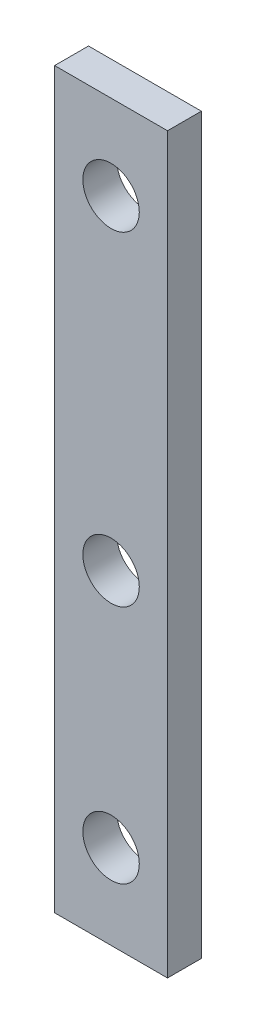
ISO-10303-21;
HEADER;
FILE_DESCRIPTION(('STEP AP214'),'2;1');
FILE_NAME('part.step','',(''),(''),'','','');
FILE_SCHEMA(('AUTOMOTIVE_DESIGN { 1 0 10303 214 1 1 1 1 }'));
ENDSEC;
DATA;
#1=APPLICATION_CONTEXT('core data for automotive mechanical design processes');
#2=APPLICATION_PROTOCOL_DEFINITION('international standard','automotive_design',2000,#1);
#3=PRODUCT_CONTEXT('',#1,'mechanical');
#4=PRODUCT('Part','Part','',(#3));
#5=PRODUCT_RELATED_PRODUCT_CATEGORY('part','',(#4));
#6=PRODUCT_DEFINITION_FORMATION('','',#4);
#7=PRODUCT_DEFINITION_CONTEXT('part definition',#1,'design');
#8=PRODUCT_DEFINITION('design','',#6,#7);
#9=PRODUCT_DEFINITION_SHAPE('','',#8);
#10=(LENGTH_UNIT() NAMED_UNIT(*) SI_UNIT(.MILLI.,.METRE.));
#11=(NAMED_UNIT(*) PLANE_ANGLE_UNIT() SI_UNIT($,.RADIAN.));
#12=(NAMED_UNIT(*) SI_UNIT($,.STERADIAN.) SOLID_ANGLE_UNIT());
#13=UNCERTAINTY_MEASURE_WITH_UNIT(LENGTH_MEASURE(1.E-05),#10,'distance_accuracy_value','');
#14=(GEOMETRIC_REPRESENTATION_CONTEXT(3) GLOBAL_UNCERTAINTY_ASSIGNED_CONTEXT((#13)) GLOBAL_UNIT_ASSIGNED_CONTEXT((#10,
#11,#12)) REPRESENTATION_CONTEXT('',''));
#15=CARTESIAN_POINT('',(0.,0.,0.));
#16=DIRECTION('',(0.,0.,1.));
#17=DIRECTION('',(1.,0.,0.));
#18=AXIS2_PLACEMENT_3D('',#15,#16,#17);
#19=CARTESIAN_POINT('',(0.,0.,0.));
#20=DIRECTION('',(0.,0.,-1.));
#21=DIRECTION('',(-1.,0.,0.));
#22=AXIS2_PLACEMENT_3D('',#19,#20,#21);
#23=PLANE('',#22);
#24=CARTESIAN_POINT('',(0.,-100.,0.));
#25=DIRECTION('',(0.,0.,1.));
#26=DIRECTION('',(1.,0.,0.));
#27=AXIS2_PLACEMENT_3D('',#24,#25,#26);
#28=CIRCLE('',#27,10.);
#29=CARTESIAN_POINT('',(10.,-100.,0.));
#30=VERTEX_POINT('',#29);
#31=EDGE_CURVE('E87',#30,#30,#28,.T.);
#32=ORIENTED_EDGE('',*,*,#31,.T.);
#33=EDGE_LOOP('',(#32));
#34=FACE_BOUND('',#33,.T.);
#35=DIRECTION('',(0.,1.,0.));
#36=VECTOR('',#35,1.);
#37=CARTESIAN_POINT('',(-20.,-130.,0.));
#38=LINE('',#37,#36);
#39=CARTESIAN_POINT('',(-20.,-130.,0.));
#40=VERTEX_POINT('',#39);
#41=CARTESIAN_POINT('',(-20.,130.,0.));
#42=VERTEX_POINT('',#41);
#43=EDGE_CURVE('E55',#40,#42,#38,.T.);
#44=ORIENTED_EDGE('',*,*,#43,.T.);
#45=DIRECTION('',(1.,0.,0.));
#46=VECTOR('',#45,1.);
#47=CARTESIAN_POINT('',(-20.,130.,0.));
#48=LINE('',#47,#46);
#49=CARTESIAN_POINT('',(20.,130.,0.));
#50=VERTEX_POINT('',#49);
#51=EDGE_CURVE('E197',#42,#50,#48,.T.);
#52=ORIENTED_EDGE('',*,*,#51,.T.);
#53=DIRECTION('',(0.,1.,0.));
#54=VECTOR('',#53,1.);
#55=CARTESIAN_POINT('',(20.,-130.,0.));
#56=LINE('',#55,#54);
#57=CARTESIAN_POINT('',(20.,-130.,0.));
#58=VERTEX_POINT('',#57);
#59=EDGE_CURVE('E60',#50,#58,#56,.F.);
#60=ORIENTED_EDGE('',*,*,#59,.T.);
#61=DIRECTION('',(1.,0.,0.));
#62=VECTOR('',#61,1.);
#63=CARTESIAN_POINT('',(-20.,-130.,0.));
#64=LINE('',#63,#62);
#65=EDGE_CURVE('E58',#58,#40,#64,.F.);
#66=ORIENTED_EDGE('',*,*,#65,.T.);
#67=EDGE_LOOP('',(#44,#52,#60,#66));
#68=FACE_BOUND('',#67,.T.);
#69=CARTESIAN_POINT('',(0.,100.,0.));
#70=DIRECTION('',(0.,0.,1.));
#71=DIRECTION('',(1.,0.,0.));
#72=AXIS2_PLACEMENT_3D('',#69,#70,#71);
#73=CIRCLE('',#72,10.);
#74=CARTESIAN_POINT('',(10.,100.,0.));
#75=VERTEX_POINT('',#74);
#76=EDGE_CURVE('E66',#75,#75,#73,.T.);
#77=ORIENTED_EDGE('',*,*,#76,.T.);
#78=EDGE_LOOP('',(#77));
#79=FACE_BOUND('',#78,.T.);
#80=CARTESIAN_POINT('',(0.,-15.,0.));
#81=DIRECTION('',(0.,0.,1.));
#82=DIRECTION('',(1.,0.,0.));
#83=AXIS2_PLACEMENT_3D('',#80,#81,#82);
#84=CIRCLE('',#83,10.);
#85=CARTESIAN_POINT('',(10.,-15.,0.));
#86=VERTEX_POINT('',#85);
#87=EDGE_CURVE('E19',#86,#86,#84,.T.);
#88=ORIENTED_EDGE('',*,*,#87,.T.);
#89=EDGE_LOOP('',(#88));
#90=FACE_BOUND('',#89,.T.);
#91=ADVANCED_FACE('F16',(#34,#68,#79,#90),#23,.T.);
#92=CARTESIAN_POINT('',(0.,-15.,12.));
#93=DIRECTION('',(0.,0.,1.));
#94=DIRECTION('',(1.,0.,0.));
#95=AXIS2_PLACEMENT_3D('',#92,#93,#94);
#96=CYLINDRICAL_SURFACE('',#95,10.);
#97=ORIENTED_EDGE('',*,*,#87,.F.);
#98=EDGE_LOOP('',(#97));
#99=FACE_BOUND('',#98,.T.);
#100=CARTESIAN_POINT('',(0.,-15.,12.));
#101=DIRECTION('',(0.,0.,1.));
#102=DIRECTION('',(1.,0.,0.));
#103=AXIS2_PLACEMENT_3D('',#100,#101,#102);
#104=CIRCLE('',#103,10.);
#105=CARTESIAN_POINT('',(10.,-15.,12.));
#106=VERTEX_POINT('',#105);
#107=EDGE_CURVE('E84',#106,#106,#104,.T.);
#108=ORIENTED_EDGE('',*,*,#107,.T.);
#109=EDGE_LOOP('',(#108));
#110=FACE_BOUND('',#109,.T.);
#111=ADVANCED_FACE('F95',(#99,#110),#96,.F.);
#112=CARTESIAN_POINT('',(0.,100.,12.));
#113=DIRECTION('',(0.,0.,1.));
#114=DIRECTION('',(1.,0.,0.));
#115=AXIS2_PLACEMENT_3D('',#112,#113,#114);
#116=CYLINDRICAL_SURFACE('',#115,10.);
#117=ORIENTED_EDGE('',*,*,#76,.F.);
#118=EDGE_LOOP('',(#117));
#119=FACE_BOUND('',#118,.T.);
#120=CARTESIAN_POINT('',(0.,100.,12.));
#121=DIRECTION('',(0.,0.,1.));
#122=DIRECTION('',(1.,0.,0.));
#123=AXIS2_PLACEMENT_3D('',#120,#121,#122);
#124=CIRCLE('',#123,10.);
#125=CARTESIAN_POINT('',(10.,100.,12.));
#126=VERTEX_POINT('',#125);
#127=EDGE_CURVE('E81',#126,#126,#124,.T.);
#128=ORIENTED_EDGE('',*,*,#127,.T.);
#129=EDGE_LOOP('',(#128));
#130=FACE_BOUND('',#129,.T.);
#131=ADVANCED_FACE('F98',(#119,#130),#116,.F.);
#132=CARTESIAN_POINT('',(-20.,-130.,12.));
#133=DIRECTION('',(0.,1.,0.));
#134=DIRECTION('',(0.,0.,1.));
#135=AXIS2_PLACEMENT_3D('',#132,#133,#134);
#136=PLANE('',#135);
#137=DIRECTION('',(0.,0.,1.));
#138=VECTOR('',#137,1.);
#139=CARTESIAN_POINT('',(20.,-130.,12.));
#140=LINE('',#139,#138);
#141=CARTESIAN_POINT('',(20.,-130.,12.));
#142=VERTEX_POINT('',#141);
#143=EDGE_CURVE('E206',#58,#142,#140,.T.);
#144=ORIENTED_EDGE('',*,*,#143,.T.);
#145=DIRECTION('',(-1.,0.,0.));
#146=VECTOR('',#145,1.);
#147=CARTESIAN_POINT('',(0.,-130.,12.));
#148=LINE('',#147,#146);
#149=CARTESIAN_POINT('',(-20.,-130.,12.));
#150=VERTEX_POINT('',#149);
#151=EDGE_CURVE('E77',#142,#150,#148,.T.);
#152=ORIENTED_EDGE('',*,*,#151,.T.);
#153=DIRECTION('',(0.,0.,-1.));
#154=VECTOR('',#153,1.);
#155=CARTESIAN_POINT('',(-20.,-130.,12.));
#156=LINE('',#155,#154);
#157=EDGE_CURVE('E65',#150,#40,#156,.T.);
#158=ORIENTED_EDGE('',*,*,#157,.T.);
#159=ORIENTED_EDGE('',*,*,#65,.F.);
#160=EDGE_LOOP('',(#144,#152,#158,#159));
#161=FACE_BOUND('',#160,.T.);
#162=ADVANCED_FACE('F76',(#161),#136,.F.);
#163=CARTESIAN_POINT('',(-20.,-130.,12.));
#164=DIRECTION('',(1.,0.,0.));
#165=DIRECTION('',(0.,0.,-1.));
#166=AXIS2_PLACEMENT_3D('',#163,#164,#165);
#167=PLANE('',#166);
#168=ORIENTED_EDGE('',*,*,#157,.F.);
#169=DIRECTION('',(0.,1.,0.));
#170=VECTOR('',#169,1.);
#171=CARTESIAN_POINT('',(-20.,0.,12.));
#172=LINE('',#171,#170);
#173=CARTESIAN_POINT('',(-20.,130.,12.));
#174=VERTEX_POINT('',#173);
#175=EDGE_CURVE('E198',#150,#174,#172,.T.);
#176=ORIENTED_EDGE('',*,*,#175,.T.);
#177=DIRECTION('',(0.,0.,-1.));
#178=VECTOR('',#177,1.);
#179=CARTESIAN_POINT('',(-20.,130.,12.));
#180=LINE('',#179,#178);
#181=EDGE_CURVE('E73',#174,#42,#180,.T.);
#182=ORIENTED_EDGE('',*,*,#181,.T.);
#183=ORIENTED_EDGE('',*,*,#43,.F.);
#184=EDGE_LOOP('',(#168,#176,#182,#183));
#185=FACE_BOUND('',#184,.T.);
#186=ADVANCED_FACE('F70',(#185),#167,.F.);
#187=CARTESIAN_POINT('',(-20.,130.,12.));
#188=DIRECTION('',(0.,-1.,0.));
#189=DIRECTION('',(0.,0.,-1.));
#190=AXIS2_PLACEMENT_3D('',#187,#188,#189);
#191=PLANE('',#190);
#192=ORIENTED_EDGE('',*,*,#181,.F.);
#193=DIRECTION('',(-1.,0.,0.));
#194=VECTOR('',#193,1.);
#195=CARTESIAN_POINT('',(0.,130.,12.));
#196=LINE('',#195,#194);
#197=CARTESIAN_POINT('',(20.,130.,12.));
#198=VERTEX_POINT('',#197);
#199=EDGE_CURVE('E196',#174,#198,#196,.F.);
#200=ORIENTED_EDGE('',*,*,#199,.T.);
#201=DIRECTION('',(0.,0.,1.));
#202=VECTOR('',#201,1.);
#203=CARTESIAN_POINT('',(20.,130.,12.));
#204=LINE('',#203,#202);
#205=EDGE_CURVE('E34',#198,#50,#204,.F.);
#206=ORIENTED_EDGE('',*,*,#205,.T.);
#207=ORIENTED_EDGE('',*,*,#51,.F.);
#208=EDGE_LOOP('',(#192,#200,#206,#207));
#209=FACE_BOUND('',#208,.T.);
#210=ADVANCED_FACE('F119',(#209),#191,.F.);
#211=CARTESIAN_POINT('',(20.,-130.,12.));
#212=DIRECTION('',(-1.,0.,0.));
#213=DIRECTION('',(0.,0.,1.));
#214=AXIS2_PLACEMENT_3D('',#211,#212,#213);
#215=PLANE('',#214);
#216=ORIENTED_EDGE('',*,*,#205,.F.);
#217=DIRECTION('',(0.,1.,0.));
#218=VECTOR('',#217,1.);
#219=CARTESIAN_POINT('',(20.,0.,12.));
#220=LINE('',#219,#218);
#221=EDGE_CURVE('E25',#198,#142,#220,.F.);
#222=ORIENTED_EDGE('',*,*,#221,.T.);
#223=ORIENTED_EDGE('',*,*,#143,.F.);
#224=ORIENTED_EDGE('',*,*,#59,.F.);
#225=EDGE_LOOP('',(#216,#222,#223,#224));
#226=FACE_BOUND('',#225,.T.);
#227=ADVANCED_FACE('F111',(#226),#215,.F.);
#228=CARTESIAN_POINT('',(0.,-100.,12.));
#229=DIRECTION('',(0.,0.,1.));
#230=DIRECTION('',(1.,0.,0.));
#231=AXIS2_PLACEMENT_3D('',#228,#229,#230);
#232=CYLINDRICAL_SURFACE('',#231,10.);
#233=ORIENTED_EDGE('',*,*,#31,.F.);
#234=EDGE_LOOP('',(#233));
#235=FACE_BOUND('',#234,.T.);
#236=CARTESIAN_POINT('',(0.,-100.,12.));
#237=DIRECTION('',(0.,0.,1.));
#238=DIRECTION('',(1.,0.,0.));
#239=AXIS2_PLACEMENT_3D('',#236,#237,#238);
#240=CIRCLE('',#239,10.);
#241=CARTESIAN_POINT('',(10.,-100.,12.));
#242=VERTEX_POINT('',#241);
#243=EDGE_CURVE('E11',#242,#242,#240,.T.);
#244=ORIENTED_EDGE('',*,*,#243,.T.);
#245=EDGE_LOOP('',(#244));
#246=FACE_BOUND('',#245,.T.);
#247=ADVANCED_FACE('F103',(#235,#246),#232,.F.);
#248=CARTESIAN_POINT('',(0.,0.,12.));
#249=DIRECTION('',(0.,0.,-1.));
#250=DIRECTION('',(-1.,0.,0.));
#251=AXIS2_PLACEMENT_3D('',#248,#249,#250);
#252=PLANE('',#251);
#253=ORIENTED_EDGE('',*,*,#243,.F.);
#254=EDGE_LOOP('',(#253));
#255=FACE_BOUND('',#254,.T.);
#256=ORIENTED_EDGE('',*,*,#199,.F.);
#257=ORIENTED_EDGE('',*,*,#175,.F.);
#258=ORIENTED_EDGE('',*,*,#151,.F.);
#259=ORIENTED_EDGE('',*,*,#221,.F.);
#260=EDGE_LOOP('',(#256,#257,#258,#259));
#261=FACE_BOUND('',#260,.T.);
#262=ORIENTED_EDGE('',*,*,#127,.F.);
#263=EDGE_LOOP('',(#262));
#264=FACE_BOUND('',#263,.T.);
#265=ORIENTED_EDGE('',*,*,#107,.F.);
#266=EDGE_LOOP('',(#265));
#267=FACE_BOUND('',#266,.T.);
#268=ADVANCED_FACE('F101',(#255,#261,#264,#267),#252,.F.);
#269=CLOSED_SHELL('',(#91,#111,#131,#162,#186,#210,#227,#247,#268));
#270=MANIFOLD_SOLID_BREP('B1',#269);
#271=ADVANCED_BREP_SHAPE_REPRESENTATION('',(#18,#270),#14);
#272=SHAPE_DEFINITION_REPRESENTATION(#9,#271);
ENDSEC;
END-ISO-10303-21;
